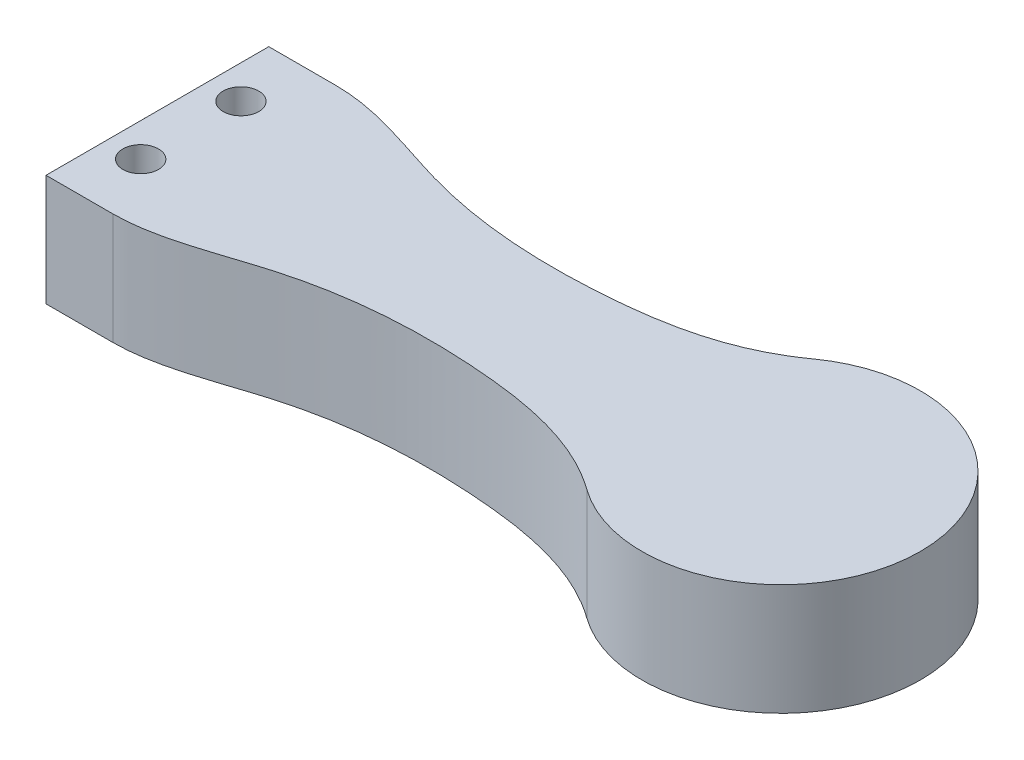
ISO-10303-21;
HEADER;
FILE_DESCRIPTION(('STEP AP214'),'2;1');
FILE_NAME('part.step','',(''),(''),'','','');
FILE_SCHEMA(('AUTOMOTIVE_DESIGN { 1 0 10303 214 1 1 1 1 }'));
ENDSEC;
DATA;
#1=APPLICATION_CONTEXT('core data for automotive mechanical design processes');
#2=APPLICATION_PROTOCOL_DEFINITION('international standard','automotive_design',2000,#1);
#3=PRODUCT_CONTEXT('',#1,'mechanical');
#4=PRODUCT('Part','Part','',(#3));
#5=PRODUCT_RELATED_PRODUCT_CATEGORY('part','',(#4));
#6=PRODUCT_DEFINITION_FORMATION('','',#4);
#7=PRODUCT_DEFINITION_CONTEXT('part definition',#1,'design');
#8=PRODUCT_DEFINITION('design','',#6,#7);
#9=PRODUCT_DEFINITION_SHAPE('','',#8);
#10=(LENGTH_UNIT() NAMED_UNIT(*) SI_UNIT(.MILLI.,.METRE.));
#11=(NAMED_UNIT(*) PLANE_ANGLE_UNIT() SI_UNIT($,.RADIAN.));
#12=(NAMED_UNIT(*) SI_UNIT($,.STERADIAN.) SOLID_ANGLE_UNIT());
#13=UNCERTAINTY_MEASURE_WITH_UNIT(LENGTH_MEASURE(1.E-05),#10,'distance_accuracy_value','');
#14=(GEOMETRIC_REPRESENTATION_CONTEXT(3) GLOBAL_UNCERTAINTY_ASSIGNED_CONTEXT((#13)) GLOBAL_UNIT_ASSIGNED_CONTEXT((#10,
#11,#12)) REPRESENTATION_CONTEXT('',''));
#15=CARTESIAN_POINT('',(0.,0.,0.));
#16=DIRECTION('',(0.,0.,1.));
#17=DIRECTION('',(1.,0.,0.));
#18=AXIS2_PLACEMENT_3D('',#15,#16,#17);
#19=CARTESIAN_POINT('',(24.4661180714283,10.,-10.1447228705404));
#20=DIRECTION('',(0.,1.,0.));
#21=DIRECTION('',(0.,0.,1.));
#22=AXIS2_PLACEMENT_3D('',#19,#20,#21);
#23=PLANE('',#22);
#24=CARTESIAN_POINT('',(0.,10.,-9.));
#25=DIRECTION('',(0.,1.,0.));
#26=DIRECTION('',(0.,0.,1.));
#27=AXIS2_PLACEMENT_3D('',#24,#25,#26);
#28=CIRCLE('',#27,1.6);
#29=CARTESIAN_POINT('',(0.,10.,-7.4));
#30=VERTEX_POINT('',#29);
#31=EDGE_CURVE('E210',#30,#30,#28,.T.);
#32=ORIENTED_EDGE('',*,*,#31,.F.);
#33=EDGE_LOOP('',(#32));
#34=FACE_BOUND('',#33,.T.);
#35=DIRECTION('',(1.,0.,0.));
#36=VECTOR('',#35,1.);
#37=CARTESIAN_POINT('',(-3.,10.,-14.5));
#38=LINE('',#37,#36);
#39=CARTESIAN_POINT('',(-3.,10.,-14.5));
#40=VERTEX_POINT('',#39);
#41=CARTESIAN_POINT('',(3.,10.,-14.5));
#42=VERTEX_POINT('',#41);
#43=EDGE_CURVE('E202',#40,#42,#38,.T.);
#44=ORIENTED_EDGE('',*,*,#43,.F.);
#45=DIRECTION('',(0.,0.,1.));
#46=VECTOR('',#45,1.);
#47=CARTESIAN_POINT('',(-3.,10.,-14.5));
#48=LINE('',#47,#46);
#49=CARTESIAN_POINT('',(-3.,10.,5.5));
#50=VERTEX_POINT('',#49);
#51=EDGE_CURVE('E160',#40,#50,#48,.T.);
#52=ORIENTED_EDGE('',*,*,#51,.T.);
#53=DIRECTION('',(1.,0.,0.));
#54=VECTOR('',#53,1.);
#55=CARTESIAN_POINT('',(-3.,10.,5.5));
#56=LINE('',#55,#54);
#57=CARTESIAN_POINT('',(3.,10.,5.5));
#58=VERTEX_POINT('',#57);
#59=EDGE_CURVE('E153',#50,#58,#56,.T.);
#60=ORIENTED_EDGE('',*,*,#59,.T.);
#61=CARTESIAN_POINT('',(3.,10.,5.5));
#62=CARTESIAN_POINT('',(7.11468230621467,10.,5.5));
#63=CARTESIAN_POINT('',(16.3201935366213,10.,1.3167633111738));
#64=CARTESIAN_POINT('',(31.0774204798553,10.,0.595600444855443));
#65=CARTESIAN_POINT('',(41.4425108790523,10.,2.59007073888755));
#66=CARTESIAN_POINT('',(45.7096036010832,10.,5.65382294245179));
#67=B_SPLINE_CURVE_WITH_KNOTS('',3,(#61,#62,#63,#64,#65,#66),.UNSPECIFIED.,.F.,.F.,(4,1,1,4),
(0.,0.285144110014069,0.663251595388767,1.),.UNSPECIFIED.);
#68=CARTESIAN_POINT('',(45.7096036010832,10.,5.65382294245179));
#69=VERTEX_POINT('',#68);
#70=EDGE_CURVE('E158',#58,#69,#67,.T.);
#71=ORIENTED_EDGE('',*,*,#70,.T.);
#72=CARTESIAN_POINT('',(53.,10.,-4.5));
#73=DIRECTION('',(0.,1.,0.));
#74=DIRECTION('',(0.,0.,1.));
#75=AXIS2_PLACEMENT_3D('',#72,#73,#74);
#76=CIRCLE('',#75,12.5);
#77=CARTESIAN_POINT('',(45.7096036010832,10.,-14.6538229424518));
#78=VERTEX_POINT('',#77);
#79=EDGE_CURVE('E175',#69,#78,#76,.T.);
#80=ORIENTED_EDGE('',*,*,#79,.T.);
#81=CARTESIAN_POINT('',(3.,10.,-14.5));
#82=CARTESIAN_POINT('',(7.11468230621467,10.,-14.5));
#83=CARTESIAN_POINT('',(16.3201935366212,10.,-10.3167633111738));
#84=CARTESIAN_POINT('',(31.0774204798553,10.,-9.59560044485544));
#85=CARTESIAN_POINT('',(41.4425108790523,10.,-11.5900707388875));
#86=CARTESIAN_POINT('',(45.7096036010832,10.,-14.6538229424518));
#87=B_SPLINE_CURVE_WITH_KNOTS('',3,(#81,#82,#83,#84,#85,#86),.UNSPECIFIED.,.F.,.F.,(4,1,1,4),
(0.,0.285144110014069,0.663251595388767,1.),.UNSPECIFIED.);
#88=EDGE_CURVE('E177',#42,#78,#87,.T.);
#89=ORIENTED_EDGE('',*,*,#88,.F.);
#90=EDGE_LOOP('',(#44,#52,#60,#71,#80,#89));
#91=FACE_BOUND('',#90,.T.);
#92=CARTESIAN_POINT('',(0.,10.,0.));
#93=DIRECTION('',(0.,1.,0.));
#94=DIRECTION('',(0.,0.,1.));
#95=AXIS2_PLACEMENT_3D('',#92,#93,#94);
#96=CIRCLE('',#95,1.6);
#97=CARTESIAN_POINT('',(0.,10.,1.6));
#98=VERTEX_POINT('',#97);
#99=EDGE_CURVE('E211',#98,#98,#96,.T.);
#100=ORIENTED_EDGE('',*,*,#99,.F.);
#101=EDGE_LOOP('',(#100));
#102=FACE_BOUND('',#101,.T.);
#103=ADVANCED_FACE('F95',(#34,#91,#102),#23,.T.);
#104=CARTESIAN_POINT('',(24.4661180714283,0.,-10.1447228705404));
#105=DIRECTION('',(0.,1.,0.));
#106=DIRECTION('',(0.,0.,1.));
#107=AXIS2_PLACEMENT_3D('',#104,#105,#106);
#108=PLANE('',#107);
#109=DIRECTION('',(1.,0.,0.));
#110=VECTOR('',#109,1.);
#111=CARTESIAN_POINT('',(-3.,0.,-14.5));
#112=LINE('',#111,#110);
#113=CARTESIAN_POINT('',(-3.,0.,-14.5));
#114=VERTEX_POINT('',#113);
#115=CARTESIAN_POINT('',(3.,0.,-14.5));
#116=VERTEX_POINT('',#115);
#117=EDGE_CURVE('E214',#114,#116,#112,.T.);
#118=ORIENTED_EDGE('',*,*,#117,.T.);
#119=CARTESIAN_POINT('',(3.,0.,-14.5));
#120=CARTESIAN_POINT('',(7.11468230621467,0.,-14.5));
#121=CARTESIAN_POINT('',(16.3201935366212,0.,-10.3167633111738));
#122=CARTESIAN_POINT('',(31.0774204798553,0.,-9.59560044485544));
#123=CARTESIAN_POINT('',(41.4425108790523,0.,-11.5900707388875));
#124=CARTESIAN_POINT('',(45.7096036010832,0.,-14.6538229424518));
#125=B_SPLINE_CURVE_WITH_KNOTS('',3,(#119,#120,#121,#122,#123,#124),.UNSPECIFIED.,.F.,.F.,(4,1,
1,4),(0.,0.285144110014069,0.663251595388767,1.),.UNSPECIFIED.);
#126=CARTESIAN_POINT('',(45.7096036010832,0.,-14.6538229424518));
#127=VERTEX_POINT('',#126);
#128=EDGE_CURVE('E245',#116,#127,#125,.T.);
#129=ORIENTED_EDGE('',*,*,#128,.T.);
#130=CARTESIAN_POINT('',(53.,0.,-4.5));
#131=DIRECTION('',(0.,1.,0.));
#132=DIRECTION('',(0.,0.,1.));
#133=AXIS2_PLACEMENT_3D('',#130,#131,#132);
#134=CIRCLE('',#133,12.5);
#135=CARTESIAN_POINT('',(45.7096036010832,0.,5.65382294245179));
#136=VERTEX_POINT('',#135);
#137=EDGE_CURVE('E247',#136,#127,#134,.T.);
#138=ORIENTED_EDGE('',*,*,#137,.F.);
#139=CARTESIAN_POINT('',(3.,0.,5.5));
#140=CARTESIAN_POINT('',(7.11468230621467,0.,5.5));
#141=CARTESIAN_POINT('',(16.3201935366213,0.,1.3167633111738));
#142=CARTESIAN_POINT('',(31.0774204798553,0.,0.595600444855443));
#143=CARTESIAN_POINT('',(41.4425108790523,0.,2.59007073888755));
#144=CARTESIAN_POINT('',(45.7096036010832,0.,5.65382294245179));
#145=B_SPLINE_CURVE_WITH_KNOTS('',3,(#139,#140,#141,#142,#143,#144),.UNSPECIFIED.,.F.,.F.,(4,1,
1,4),(0.,0.285144110014069,0.663251595388767,1.),.UNSPECIFIED.);
#146=CARTESIAN_POINT('',(3.,0.,5.5));
#147=VERTEX_POINT('',#146);
#148=EDGE_CURVE('E257',#147,#136,#145,.T.);
#149=ORIENTED_EDGE('',*,*,#148,.F.);
#150=DIRECTION('',(1.,0.,0.));
#151=VECTOR('',#150,1.);
#152=CARTESIAN_POINT('',(-3.,0.,5.5));
#153=LINE('',#152,#151);
#154=CARTESIAN_POINT('',(-3.,0.,5.5));
#155=VERTEX_POINT('',#154);
#156=EDGE_CURVE('E167',#155,#147,#153,.T.);
#157=ORIENTED_EDGE('',*,*,#156,.F.);
#158=DIRECTION('',(0.,0.,1.));
#159=VECTOR('',#158,1.);
#160=CARTESIAN_POINT('',(-3.,0.,-14.5));
#161=LINE('',#160,#159);
#162=EDGE_CURVE('E135',#114,#155,#161,.T.);
#163=ORIENTED_EDGE('',*,*,#162,.F.);
#164=EDGE_LOOP('',(#118,#129,#138,#149,#157,#163));
#165=FACE_BOUND('',#164,.T.);
#166=CARTESIAN_POINT('',(0.,0.,-9.));
#167=DIRECTION('',(0.,1.,0.));
#168=DIRECTION('',(0.,0.,1.));
#169=AXIS2_PLACEMENT_3D('',#166,#167,#168);
#170=CIRCLE('',#169,1.6);
#171=CARTESIAN_POINT('',(0.,0.,-7.4));
#172=VERTEX_POINT('',#171);
#173=EDGE_CURVE('E207',#172,#172,#170,.T.);
#174=ORIENTED_EDGE('',*,*,#173,.T.);
#175=EDGE_LOOP('',(#174));
#176=FACE_BOUND('',#175,.T.);
#177=CARTESIAN_POINT('',(0.,0.,0.));
#178=DIRECTION('',(0.,1.,0.));
#179=DIRECTION('',(0.,0.,1.));
#180=AXIS2_PLACEMENT_3D('',#177,#178,#179);
#181=CIRCLE('',#180,1.6);
#182=CARTESIAN_POINT('',(0.,0.,1.6));
#183=VERTEX_POINT('',#182);
#184=EDGE_CURVE('E215',#183,#183,#181,.T.);
#185=ORIENTED_EDGE('',*,*,#184,.T.);
#186=EDGE_LOOP('',(#185));
#187=FACE_BOUND('',#186,.T.);
#188=ADVANCED_FACE('F224',(#165,#176,#187),#108,.F.);
#189=CARTESIAN_POINT('',(-3.,10.,-14.5));
#190=DIRECTION('',(0.,0.,-1.));
#191=DIRECTION('',(-1.,0.,0.));
#192=AXIS2_PLACEMENT_3D('',#189,#190,#191);
#193=PLANE('',#192);
#194=ORIENTED_EDGE('',*,*,#117,.F.);
#195=DIRECTION('',(0.,-1.,0.));
#196=VECTOR('',#195,1.);
#197=CARTESIAN_POINT('',(-3.,10.,-14.5));
#198=LINE('',#197,#196);
#199=EDGE_CURVE('E12',#40,#114,#198,.T.);
#200=ORIENTED_EDGE('',*,*,#199,.F.);
#201=ORIENTED_EDGE('',*,*,#43,.T.);
#202=DIRECTION('',(0.,-1.,0.));
#203=VECTOR('',#202,1.);
#204=CARTESIAN_POINT('',(3.,10.,-14.5));
#205=LINE('',#204,#203);
#206=EDGE_CURVE('E99',#42,#116,#205,.T.);
#207=ORIENTED_EDGE('',*,*,#206,.T.);
#208=EDGE_LOOP('',(#194,#200,#201,#207));
#209=FACE_BOUND('',#208,.T.);
#210=ADVANCED_FACE('F97',(#209),#193,.T.);
#211=CARTESIAN_POINT('',(-3.,10.,-14.5));
#212=DIRECTION('',(1.,0.,0.));
#213=DIRECTION('',(0.,0.,-1.));
#214=AXIS2_PLACEMENT_3D('',#211,#212,#213);
#215=PLANE('',#214);
#216=ORIENTED_EDGE('',*,*,#162,.T.);
#217=DIRECTION('',(0.,-1.,0.));
#218=VECTOR('',#217,1.);
#219=CARTESIAN_POINT('',(-3.,10.,5.5));
#220=LINE('',#219,#218);
#221=EDGE_CURVE('E105',#50,#155,#220,.T.);
#222=ORIENTED_EDGE('',*,*,#221,.F.);
#223=ORIENTED_EDGE('',*,*,#51,.F.);
#224=ORIENTED_EDGE('',*,*,#199,.T.);
#225=EDGE_LOOP('',(#216,#222,#223,#224));
#226=FACE_BOUND('',#225,.T.);
#227=ADVANCED_FACE('F235',(#226),#215,.F.);
#228=CARTESIAN_POINT('',(-3.,10.,5.5));
#229=DIRECTION('',(0.,0.,-1.));
#230=DIRECTION('',(-1.,0.,0.));
#231=AXIS2_PLACEMENT_3D('',#228,#229,#230);
#232=PLANE('',#231);
#233=ORIENTED_EDGE('',*,*,#156,.T.);
#234=DIRECTION('',(0.,-1.,0.));
#235=VECTOR('',#234,1.);
#236=CARTESIAN_POINT('',(3.,10.,5.5));
#237=LINE('',#236,#235);
#238=EDGE_CURVE('E164',#58,#147,#237,.T.);
#239=ORIENTED_EDGE('',*,*,#238,.F.);
#240=ORIENTED_EDGE('',*,*,#59,.F.);
#241=ORIENTED_EDGE('',*,*,#221,.T.);
#242=EDGE_LOOP('',(#233,#239,#240,#241));
#243=FACE_BOUND('',#242,.T.);
#244=ADVANCED_FACE('F165',(#243),#232,.F.);
#245=DIRECTION('',(0.,-1.,0.));
#246=VECTOR('',#245,1.);
#247=SURFACE_OF_LINEAR_EXTRUSION('',#67,#246);
#248=ORIENTED_EDGE('',*,*,#148,.T.);
#249=DIRECTION('',(0.,-1.,0.));
#250=VECTOR('',#249,1.);
#251=CARTESIAN_POINT('',(45.7096036010832,10.,5.65382294245179));
#252=LINE('',#251,#250);
#253=EDGE_CURVE('E170',#69,#136,#252,.T.);
#254=ORIENTED_EDGE('',*,*,#253,.F.);
#255=ORIENTED_EDGE('',*,*,#70,.F.);
#256=ORIENTED_EDGE('',*,*,#238,.T.);
#257=EDGE_LOOP('',(#248,#254,#255,#256));
#258=FACE_BOUND('',#257,.T.);
#259=ADVANCED_FACE('F172',(#258),#247,.F.);
#260=CARTESIAN_POINT('',(53.,10.,-4.5));
#261=DIRECTION('',(0.,-1.,0.));
#262=DIRECTION('',(0.,0.,-1.));
#263=AXIS2_PLACEMENT_3D('',#260,#261,#262);
#264=CYLINDRICAL_SURFACE('',#263,12.5);
#265=ORIENTED_EDGE('',*,*,#137,.T.);
#266=DIRECTION('',(0.,-1.,0.));
#267=VECTOR('',#266,1.);
#268=CARTESIAN_POINT('',(45.7096036010832,10.,-14.6538229424518));
#269=LINE('',#268,#267);
#270=EDGE_CURVE('E267',#78,#127,#269,.T.);
#271=ORIENTED_EDGE('',*,*,#270,.F.);
#272=ORIENTED_EDGE('',*,*,#79,.F.);
#273=ORIENTED_EDGE('',*,*,#253,.T.);
#274=EDGE_LOOP('',(#265,#271,#272,#273));
#275=FACE_BOUND('',#274,.T.);
#276=ADVANCED_FACE('F191',(#275),#264,.T.);
#277=DIRECTION('',(0.,-1.,0.));
#278=VECTOR('',#277,1.);
#279=SURFACE_OF_LINEAR_EXTRUSION('',#87,#278);
#280=ORIENTED_EDGE('',*,*,#128,.F.);
#281=ORIENTED_EDGE('',*,*,#206,.F.);
#282=ORIENTED_EDGE('',*,*,#88,.T.);
#283=ORIENTED_EDGE('',*,*,#270,.T.);
#284=EDGE_LOOP('',(#280,#281,#282,#283));
#285=FACE_BOUND('',#284,.T.);
#286=ADVANCED_FACE('F194',(#285),#279,.T.);
#287=CARTESIAN_POINT('',(0.,10.,-9.));
#288=DIRECTION('',(0.,-1.,0.));
#289=DIRECTION('',(0.,0.,-1.));
#290=AXIS2_PLACEMENT_3D('',#287,#288,#289);
#291=CYLINDRICAL_SURFACE('',#290,1.6);
#292=ORIENTED_EDGE('',*,*,#31,.T.);
#293=EDGE_LOOP('',(#292));
#294=FACE_BOUND('',#293,.T.);
#295=ORIENTED_EDGE('',*,*,#173,.F.);
#296=EDGE_LOOP('',(#295));
#297=FACE_BOUND('',#296,.T.);
#298=ADVANCED_FACE('F197',(#294,#297),#291,.F.);
#299=CARTESIAN_POINT('',(0.,10.,0.));
#300=DIRECTION('',(0.,-1.,0.));
#301=DIRECTION('',(0.,0.,-1.));
#302=AXIS2_PLACEMENT_3D('',#299,#300,#301);
#303=CYLINDRICAL_SURFACE('',#302,1.6);
#304=ORIENTED_EDGE('',*,*,#99,.T.);
#305=EDGE_LOOP('',(#304));
#306=FACE_BOUND('',#305,.T.);
#307=ORIENTED_EDGE('',*,*,#184,.F.);
#308=EDGE_LOOP('',(#307));
#309=FACE_BOUND('',#308,.T.);
#310=ADVANCED_FACE('F221',(#306,#309),#303,.F.);
#311=CLOSED_SHELL('',(#103,#188,#210,#227,#244,#259,#276,#286,#298,#310));
#312=MANIFOLD_SOLID_BREP('B2',#311);
#313=ADVANCED_BREP_SHAPE_REPRESENTATION('',(#18,#312),#14);
#314=SHAPE_DEFINITION_REPRESENTATION(#9,#313);
ENDSEC;
END-ISO-10303-21;
